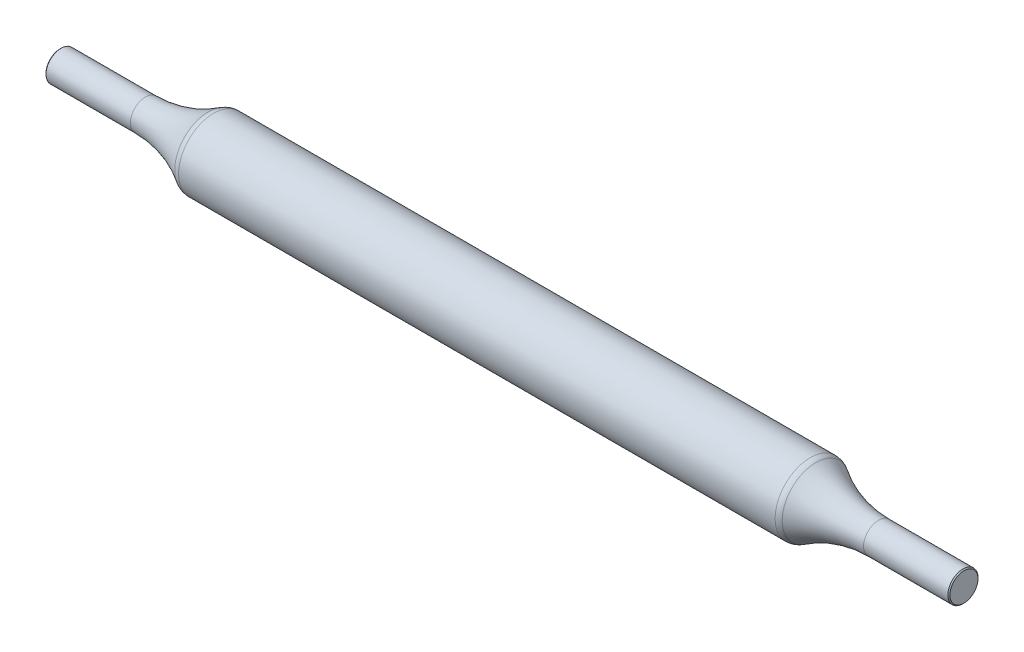
ISO-10303-21;
HEADER;
FILE_DESCRIPTION(('STEP AP214'),'2;1');
FILE_NAME('part.step','',(''),(''),'','','');
FILE_SCHEMA(('AUTOMOTIVE_DESIGN { 1 0 10303 214 1 1 1 1 }'));
ENDSEC;
DATA;
#1=APPLICATION_CONTEXT('core data for automotive mechanical design processes');
#2=APPLICATION_PROTOCOL_DEFINITION('international standard','automotive_design',2000,#1);
#3=PRODUCT_CONTEXT('',#1,'mechanical');
#4=PRODUCT('Part','Part','',(#3));
#5=PRODUCT_RELATED_PRODUCT_CATEGORY('part','',(#4));
#6=PRODUCT_DEFINITION_FORMATION('','',#4);
#7=PRODUCT_DEFINITION_CONTEXT('part definition',#1,'design');
#8=PRODUCT_DEFINITION('design','',#6,#7);
#9=PRODUCT_DEFINITION_SHAPE('','',#8);
#10=(LENGTH_UNIT() NAMED_UNIT(*) SI_UNIT(.MILLI.,.METRE.));
#11=(NAMED_UNIT(*) PLANE_ANGLE_UNIT() SI_UNIT($,.RADIAN.));
#12=(NAMED_UNIT(*) SI_UNIT($,.STERADIAN.) SOLID_ANGLE_UNIT());
#13=UNCERTAINTY_MEASURE_WITH_UNIT(LENGTH_MEASURE(1.E-05),#10,'distance_accuracy_value','');
#14=(GEOMETRIC_REPRESENTATION_CONTEXT(3) GLOBAL_UNCERTAINTY_ASSIGNED_CONTEXT((#13)) GLOBAL_UNIT_ASSIGNED_CONTEXT((#10,
#11,#12)) REPRESENTATION_CONTEXT('',''));
#15=CARTESIAN_POINT('',(0.,0.,0.));
#16=DIRECTION('',(0.,0.,1.));
#17=DIRECTION('',(1.,0.,0.));
#18=AXIS2_PLACEMENT_3D('',#15,#16,#17);
#19=CARTESIAN_POINT('',(-22.5,0.,0.));
#20=DIRECTION('',(1.,0.,0.));
#21=DIRECTION('',(0.,1.,0.));
#22=AXIS2_PLACEMENT_3D('',#19,#20,#21);
#23=PLANE('',#22);
#24=CARTESIAN_POINT('',(-22.5,0.,0.));
#25=DIRECTION('',(1.,0.,0.));
#26=DIRECTION('',(0.,1.,0.));
#27=AXIS2_PLACEMENT_3D('',#24,#25,#26);
#28=CIRCLE('',#27,0.700000000000006);
#29=CARTESIAN_POINT('',(-22.5,0.700000000000006,0.));
#30=VERTEX_POINT('',#29);
#31=EDGE_CURVE('E43',#30,#30,#28,.F.);
#32=ORIENTED_EDGE('',*,*,#31,.T.);
#33=EDGE_LOOP('',(#32));
#34=FACE_BOUND('',#33,.T.);
#35=ADVANCED_FACE('F35',(#34),#23,.F.);
#36=CARTESIAN_POINT('',(22.5,0.,0.));
#37=DIRECTION('',(-1.,0.,0.));
#38=DIRECTION('',(0.,-1.,0.));
#39=AXIS2_PLACEMENT_3D('',#36,#37,#38);
#40=PLANE('',#39);
#41=CARTESIAN_POINT('',(22.5,0.,0.));
#42=DIRECTION('',(-1.,0.,0.));
#43=DIRECTION('',(0.,-1.,0.));
#44=AXIS2_PLACEMENT_3D('',#41,#42,#43);
#45=CIRCLE('',#44,0.699999999999985);
#46=CARTESIAN_POINT('',(22.5,-0.699999999999977,0.));
#47=VERTEX_POINT('',#46);
#48=EDGE_CURVE('E47',#47,#47,#45,.F.);
#49=ORIENTED_EDGE('',*,*,#48,.T.);
#50=EDGE_LOOP('',(#49));
#51=FACE_BOUND('',#50,.T.);
#52=ADVANCED_FACE('F92',(#51),#40,.F.);
#53=CARTESIAN_POINT('',(-22.5,0.,0.));
#54=DIRECTION('',(-1.,0.,0.));
#55=DIRECTION('',(0.,-1.,0.));
#56=AXIS2_PLACEMENT_3D('',#53,#54,#55);
#57=CYLINDRICAL_SURFACE('',#56,0.75);
#58=CARTESIAN_POINT('',(22.45,0.,0.));
#59=DIRECTION('',(-1.,0.,0.));
#60=DIRECTION('',(0.,-1.,0.));
#61=AXIS2_PLACEMENT_3D('',#58,#59,#60);
#62=CIRCLE('',#61,0.75);
#63=CARTESIAN_POINT('',(22.45,-0.749999999999991,0.));
#64=VERTEX_POINT('',#63);
#65=EDGE_CURVE('E51',#64,#64,#62,.T.);
#66=ORIENTED_EDGE('',*,*,#65,.T.);
#67=EDGE_LOOP('',(#66));
#68=FACE_BOUND('',#67,.T.);
#69=CARTESIAN_POINT('',(18.25,0.,0.));
#70=DIRECTION('',(-1.,0.,0.));
#71=DIRECTION('',(0.,-1.,0.));
#72=AXIS2_PLACEMENT_3D('',#69,#70,#71);
#73=CIRCLE('',#72,0.749999999999999);
#74=CARTESIAN_POINT('',(18.25,-0.749999999999992,0.));
#75=VERTEX_POINT('',#74);
#76=EDGE_CURVE('E68',#75,#75,#73,.T.);
#77=ORIENTED_EDGE('',*,*,#76,.F.);
#78=EDGE_LOOP('',(#77));
#79=FACE_BOUND('',#78,.T.);
#80=ADVANCED_FACE('F97',(#68,#79),#57,.T.);
#81=CARTESIAN_POINT('',(18.25,0.,0.));
#82=DIRECTION('',(-1.,0.,0.));
#83=DIRECTION('',(0.,-1.,0.));
#84=AXIS2_PLACEMENT_3D('',#81,#82,#83);
#85=TOROIDAL_SURFACE('',#84,6.53125,5.78125);
#86=CARTESIAN_POINT('',(15.1203084028407,0.,0.));
#87=DIRECTION('',(1.,0.,0.));
#88=DIRECTION('',(0.,1.,0.));
#89=AXIS2_PLACEMENT_3D('',#86,#87,#88);
#90=CIRCLE('',#89,1.67039800995025);
#91=CARTESIAN_POINT('',(15.1203084028407,1.67039800995025,0.));
#92=VERTEX_POINT('',#91);
#93=EDGE_CURVE('E56',#92,#92,#90,.T.);
#94=ORIENTED_EDGE('',*,*,#93,.T.);
#95=EDGE_LOOP('',(#94));
#96=FACE_BOUND('',#95,.T.);
#97=ORIENTED_EDGE('',*,*,#76,.T.);
#98=EDGE_LOOP('',(#97));
#99=FACE_BOUND('',#98,.T.);
#100=ADVANCED_FACE('F88',(#96,#99),#85,.F.);
#101=CARTESIAN_POINT('',(-22.5,0.,0.));
#102=DIRECTION('',(-1.,0.,0.));
#103=DIRECTION('',(0.,-1.,0.));
#104=AXIS2_PLACEMENT_3D('',#101,#102,#103);
#105=CYLINDRICAL_SURFACE('',#104,1.75);
#106=CARTESIAN_POINT('',(-14.8496323728161,0.,0.));
#107=DIRECTION('',(1.,0.,0.));
#108=DIRECTION('',(0.,1.,0.));
#109=AXIS2_PLACEMENT_3D('',#106,#107,#108);
#110=CIRCLE('',#109,1.75);
#111=CARTESIAN_POINT('',(-14.8496323728161,1.75,0.));
#112=VERTEX_POINT('',#111);
#113=EDGE_CURVE('E59',#112,#112,#110,.T.);
#114=ORIENTED_EDGE('',*,*,#113,.T.);
#115=EDGE_LOOP('',(#114));
#116=FACE_BOUND('',#115,.T.);
#117=CARTESIAN_POINT('',(14.8496323728161,0.,0.));
#118=DIRECTION('',(1.,0.,0.));
#119=DIRECTION('',(0.,1.,0.));
#120=AXIS2_PLACEMENT_3D('',#117,#118,#119);
#121=CIRCLE('',#120,1.75);
#122=CARTESIAN_POINT('',(14.8496323728161,1.75000000000001,0.));
#123=VERTEX_POINT('',#122);
#124=EDGE_CURVE('E62',#123,#123,#121,.F.);
#125=ORIENTED_EDGE('',*,*,#124,.T.);
#126=EDGE_LOOP('',(#125));
#127=FACE_BOUND('',#126,.T.);
#128=ADVANCED_FACE('F79',(#116,#127),#105,.T.);
#129=CARTESIAN_POINT('',(-18.25,0.,0.));
#130=DIRECTION('',(-1.,0.,0.));
#131=DIRECTION('',(0.,-1.,0.));
#132=AXIS2_PLACEMENT_3D('',#129,#130,#131);
#133=TOROIDAL_SURFACE('',#132,6.53125,5.78125);
#134=CARTESIAN_POINT('',(-15.1203084028407,0.,0.));
#135=DIRECTION('',(-1.,0.,0.));
#136=DIRECTION('',(0.,-1.,0.));
#137=AXIS2_PLACEMENT_3D('',#134,#135,#136);
#138=CIRCLE('',#137,1.67039800995025);
#139=CARTESIAN_POINT('',(-15.1203084028407,-1.67039800995025,0.));
#140=VERTEX_POINT('',#139);
#141=EDGE_CURVE('E65',#140,#140,#138,.T.);
#142=ORIENTED_EDGE('',*,*,#141,.T.);
#143=EDGE_LOOP('',(#142));
#144=FACE_BOUND('',#143,.T.);
#145=CARTESIAN_POINT('',(-18.25,0.,0.));
#146=DIRECTION('',(-1.,0.,0.));
#147=DIRECTION('',(0.,-1.,0.));
#148=AXIS2_PLACEMENT_3D('',#145,#146,#147);
#149=CIRCLE('',#148,0.749999999999998);
#150=CARTESIAN_POINT('',(-18.25,-0.749999999999997,0.));
#151=VERTEX_POINT('',#150);
#152=EDGE_CURVE('E71',#151,#151,#149,.T.);
#153=ORIENTED_EDGE('',*,*,#152,.F.);
#154=EDGE_LOOP('',(#153));
#155=FACE_BOUND('',#154,.T.);
#156=ADVANCED_FACE('F77',(#144,#155),#133,.F.);
#157=CARTESIAN_POINT('',(-22.5,0.,0.));
#158=DIRECTION('',(-1.,0.,0.));
#159=DIRECTION('',(0.,-1.,0.));
#160=AXIS2_PLACEMENT_3D('',#157,#158,#159);
#161=CYLINDRICAL_SURFACE('',#160,0.749999999999999);
#162=CARTESIAN_POINT('',(-22.45,0.,0.));
#163=DIRECTION('',(1.,0.,0.));
#164=DIRECTION('',(0.,1.,0.));
#165=AXIS2_PLACEMENT_3D('',#162,#163,#164);
#166=CIRCLE('',#165,0.749999999999999);
#167=CARTESIAN_POINT('',(-22.45,0.749999999999999,0.));
#168=VERTEX_POINT('',#167);
#169=EDGE_CURVE('E10',#168,#168,#166,.T.);
#170=ORIENTED_EDGE('',*,*,#169,.T.);
#171=EDGE_LOOP('',(#170));
#172=FACE_BOUND('',#171,.T.);
#173=ORIENTED_EDGE('',*,*,#152,.T.);
#174=EDGE_LOOP('',(#173));
#175=FACE_BOUND('',#174,.T.);
#176=ADVANCED_FACE('F75',(#172,#175),#161,.T.);
#177=CARTESIAN_POINT('',(-14.8496323728161,0.,0.));
#178=DIRECTION('',(1.,0.,0.));
#179=DIRECTION('',(0.,1.,0.));
#180=AXIS2_PLACEMENT_3D('',#177,#178,#179);
#181=TOROIDAL_SURFACE('',#180,1.25,0.5);
#182=ORIENTED_EDGE('',*,*,#113,.F.);
#183=EDGE_LOOP('',(#182));
#184=FACE_BOUND('',#183,.T.);
#185=ORIENTED_EDGE('',*,*,#141,.F.);
#186=EDGE_LOOP('',(#185));
#187=FACE_BOUND('',#186,.T.);
#188=ADVANCED_FACE('F86',(#184,#187),#181,.T.);
#189=CARTESIAN_POINT('',(14.8496323728161,0.,0.));
#190=DIRECTION('',(1.,0.,0.));
#191=DIRECTION('',(0.,1.,0.));
#192=AXIS2_PLACEMENT_3D('',#189,#190,#191);
#193=TOROIDAL_SURFACE('',#192,1.25,0.5);
#194=ORIENTED_EDGE('',*,*,#93,.F.);
#195=EDGE_LOOP('',(#194));
#196=FACE_BOUND('',#195,.T.);
#197=ORIENTED_EDGE('',*,*,#124,.F.);
#198=EDGE_LOOP('',(#197));
#199=FACE_BOUND('',#198,.T.);
#200=ADVANCED_FACE('F104',(#196,#199),#193,.T.);
#201=CARTESIAN_POINT('',(22.45,0.,0.));
#202=DIRECTION('',(-1.,0.,0.));
#203=DIRECTION('',(0.,-1.,0.));
#204=AXIS2_PLACEMENT_3D('',#201,#202,#203);
#205=CONICAL_SURFACE('',#204,0.75,0.785398163397437);
#206=ORIENTED_EDGE('',*,*,#48,.F.);
#207=EDGE_LOOP('',(#206));
#208=FACE_BOUND('',#207,.T.);
#209=ORIENTED_EDGE('',*,*,#65,.F.);
#210=EDGE_LOOP('',(#209));
#211=FACE_BOUND('',#210,.T.);
#212=ADVANCED_FACE('F107',(#208,#211),#205,.T.);
#213=CARTESIAN_POINT('',(-22.5,0.,0.));
#214=DIRECTION('',(1.,0.,0.));
#215=DIRECTION('',(0.,1.,0.));
#216=AXIS2_PLACEMENT_3D('',#213,#214,#215);
#217=CONICAL_SURFACE('',#216,0.700000000000006,0.785398163397469);
#218=ORIENTED_EDGE('',*,*,#169,.F.);
#219=EDGE_LOOP('',(#218));
#220=FACE_BOUND('',#219,.T.);
#221=ORIENTED_EDGE('',*,*,#31,.F.);
#222=EDGE_LOOP('',(#221));
#223=FACE_BOUND('',#222,.T.);
#224=ADVANCED_FACE('F38',(#220,#223),#217,.T.);
#225=CLOSED_SHELL('',(#35,#52,#80,#100,#128,#156,#176,#188,#200,#212,#224));
#226=MANIFOLD_SOLID_BREP('B2',#225);
#227=ADVANCED_BREP_SHAPE_REPRESENTATION('',(#18,#226),#14);
#228=SHAPE_DEFINITION_REPRESENTATION(#9,#227);
ENDSEC;
END-ISO-10303-21;
